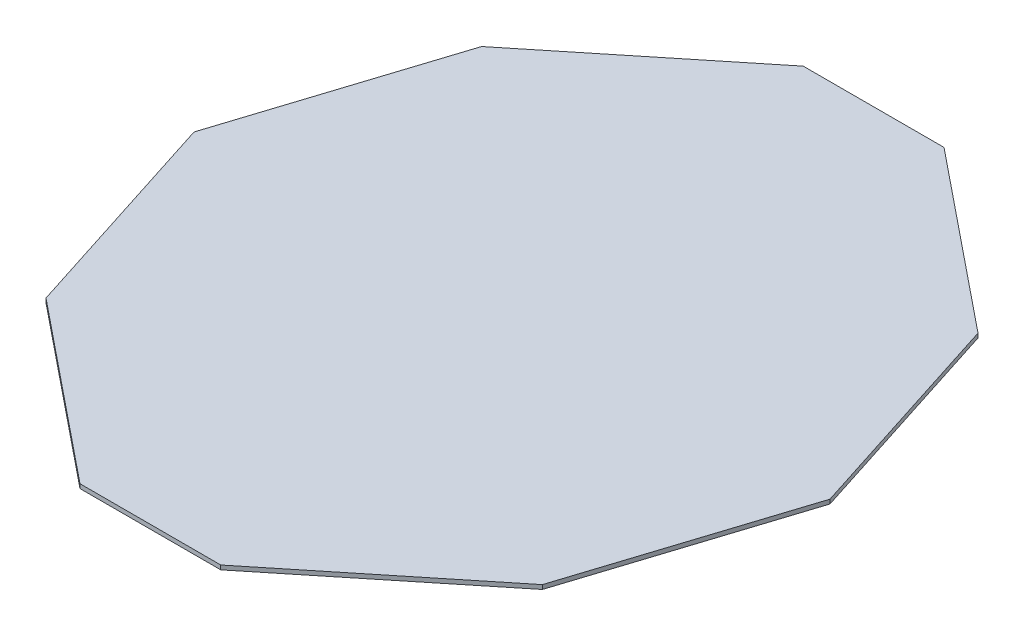
ISO-10303-21;
HEADER;
FILE_DESCRIPTION(('STEP AP214'),'2;1');
FILE_NAME('part.step','',(''),(''),'','','');
FILE_SCHEMA(('AUTOMOTIVE_DESIGN { 1 0 10303 214 1 1 1 1 }'));
ENDSEC;
DATA;
#1=APPLICATION_CONTEXT('core data for automotive mechanical design processes');
#2=APPLICATION_PROTOCOL_DEFINITION('international standard','automotive_design',2000,#1);
#3=PRODUCT_CONTEXT('',#1,'mechanical');
#4=PRODUCT('Part','Part','',(#3));
#5=PRODUCT_RELATED_PRODUCT_CATEGORY('part','',(#4));
#6=PRODUCT_DEFINITION_FORMATION('','',#4);
#7=PRODUCT_DEFINITION_CONTEXT('part definition',#1,'design');
#8=PRODUCT_DEFINITION('design','',#6,#7);
#9=PRODUCT_DEFINITION_SHAPE('','',#8);
#10=(LENGTH_UNIT() NAMED_UNIT(*) SI_UNIT(.MILLI.,.METRE.));
#11=(NAMED_UNIT(*) PLANE_ANGLE_UNIT() SI_UNIT($,.RADIAN.));
#12=(NAMED_UNIT(*) SI_UNIT($,.STERADIAN.) SOLID_ANGLE_UNIT());
#13=UNCERTAINTY_MEASURE_WITH_UNIT(LENGTH_MEASURE(1.E-05),#10,'distance_accuracy_value','');
#14=(GEOMETRIC_REPRESENTATION_CONTEXT(3) GLOBAL_UNCERTAINTY_ASSIGNED_CONTEXT((#13)) GLOBAL_UNIT_ASSIGNED_CONTEXT((#10,
#11,#12)) REPRESENTATION_CONTEXT('',''));
#15=CARTESIAN_POINT('',(0.,0.,0.));
#16=DIRECTION('',(0.,0.,1.));
#17=DIRECTION('',(1.,0.,0.));
#18=AXIS2_PLACEMENT_3D('',#15,#16,#17);
#19=CARTESIAN_POINT('',(-10.1075721399106,0.24,-8.1753890082676));
#20=DIRECTION('',(0.628876077559046,0.,-0.777505549223894));
#21=DIRECTION('',(-0.777505549223894,0.,-0.628876077559046));
#22=AXIS2_PLACEMENT_3D('',#19,#20,#21);
#23=PLANE('',#22);
#24=DIRECTION('',(0.777505549223894,0.,0.628876077559046));
#25=VECTOR('',#24,1.);
#26=CARTESIAN_POINT('',(-10.1075721399106,0.,-8.1753890082676));
#27=LINE('',#26,#25);
#28=CARTESIAN_POINT('',(-10.1075721399106,0.,-8.1753890082676));
#29=VERTEX_POINT('',#28);
#30=CARTESIAN_POINT('',(0.,0.,0.));
#31=VERTEX_POINT('',#30);
#32=EDGE_CURVE('E161',#29,#31,#27,.T.);
#33=ORIENTED_EDGE('',*,*,#32,.T.);
#34=DIRECTION('',(0.,-1.,0.));
#35=VECTOR('',#34,1.);
#36=CARTESIAN_POINT('',(0.,0.24,0.));
#37=LINE('',#36,#35);
#38=CARTESIAN_POINT('',(0.,0.24,0.));
#39=VERTEX_POINT('',#38);
#40=EDGE_CURVE('E11',#39,#31,#37,.T.);
#41=ORIENTED_EDGE('',*,*,#40,.F.);
#42=DIRECTION('',(0.777505549223894,0.,0.628876077559046));
#43=VECTOR('',#42,1.);
#44=CARTESIAN_POINT('',(-10.1075721399106,0.24,-8.1753890082676));
#45=LINE('',#44,#43);
#46=CARTESIAN_POINT('',(-10.1075721399106,0.24,-8.1753890082676));
#47=VERTEX_POINT('',#46);
#48=EDGE_CURVE('E184',#47,#39,#45,.T.);
#49=ORIENTED_EDGE('',*,*,#48,.F.);
#50=DIRECTION('',(0.,-1.,0.));
#51=VECTOR('',#50,1.);
#52=CARTESIAN_POINT('',(-10.1075721399106,0.24,-8.1753890082676));
#53=LINE('',#52,#51);
#54=EDGE_CURVE('E157',#47,#29,#53,.T.);
#55=ORIENTED_EDGE('',*,*,#54,.T.);
#56=EDGE_LOOP('',(#33,#41,#49,#55));
#57=FACE_BOUND('',#56,.T.);
#58=ADVANCED_FACE('F40',(#57),#23,.F.);
#59=CARTESIAN_POINT('',(0.,0.24,0.));
#60=DIRECTION('',(0.,0.,-1.));
#61=DIRECTION('',(-1.,0.,0.));
#62=AXIS2_PLACEMENT_3D('',#59,#60,#61);
#63=PLANE('',#62);
#64=DIRECTION('',(1.,0.,0.));
#65=VECTOR('',#64,1.);
#66=CARTESIAN_POINT('',(0.,0.,0.));
#67=LINE('',#66,#65);
#68=CARTESIAN_POINT('',(8.,0.,0.));
#69=VERTEX_POINT('',#68);
#70=EDGE_CURVE('E164',#31,#69,#67,.T.);
#71=ORIENTED_EDGE('',*,*,#70,.T.);
#72=DIRECTION('',(0.,-1.,0.));
#73=VECTOR('',#72,1.);
#74=CARTESIAN_POINT('',(8.,0.24,0.));
#75=LINE('',#74,#73);
#76=CARTESIAN_POINT('',(8.,0.24,0.));
#77=VERTEX_POINT('',#76);
#78=EDGE_CURVE('E48',#77,#69,#75,.T.);
#79=ORIENTED_EDGE('',*,*,#78,.F.);
#80=DIRECTION('',(1.,0.,0.));
#81=VECTOR('',#80,1.);
#82=CARTESIAN_POINT('',(0.,0.24,0.));
#83=LINE('',#82,#81);
#84=EDGE_CURVE('E111',#39,#77,#83,.T.);
#85=ORIENTED_EDGE('',*,*,#84,.F.);
#86=ORIENTED_EDGE('',*,*,#40,.T.);
#87=EDGE_LOOP('',(#71,#79,#85,#86));
#88=FACE_BOUND('',#87,.T.);
#89=ADVANCED_FACE('F239',(#88),#63,.F.);
#90=CARTESIAN_POINT('',(8.,0.24,0.));
#91=DIRECTION('',(-0.628876077559046,0.,-0.777505549223894));
#92=DIRECTION('',(-0.777505549223894,0.,0.628876077559046));
#93=AXIS2_PLACEMENT_3D('',#90,#91,#92);
#94=PLANE('',#93);
#95=DIRECTION('',(0.777505549223894,0.,-0.628876077559046));
#96=VECTOR('',#95,1.);
#97=CARTESIAN_POINT('',(8.,0.,0.));
#98=LINE('',#97,#96);
#99=CARTESIAN_POINT('',(18.1075721399106,0.,-8.1753890082676));
#100=VERTEX_POINT('',#99);
#101=EDGE_CURVE('E166',#69,#100,#98,.T.);
#102=ORIENTED_EDGE('',*,*,#101,.T.);
#103=DIRECTION('',(0.,-1.,0.));
#104=VECTOR('',#103,1.);
#105=CARTESIAN_POINT('',(18.1075721399106,0.24,-8.1753890082676));
#106=LINE('',#105,#104);
#107=CARTESIAN_POINT('',(18.1075721399106,0.24,-8.1753890082676));
#108=VERTEX_POINT('',#107);
#109=EDGE_CURVE('E199',#108,#100,#106,.T.);
#110=ORIENTED_EDGE('',*,*,#109,.F.);
#111=DIRECTION('',(0.777505549223894,0.,-0.628876077559046));
#112=VECTOR('',#111,1.);
#113=CARTESIAN_POINT('',(8.,0.24,0.));
#114=LINE('',#113,#112);
#115=EDGE_CURVE('E208',#77,#108,#114,.T.);
#116=ORIENTED_EDGE('',*,*,#115,.F.);
#117=ORIENTED_EDGE('',*,*,#78,.T.);
#118=EDGE_LOOP('',(#102,#110,#116,#117));
#119=FACE_BOUND('',#118,.T.);
#120=ADVANCED_FACE('F206',(#119),#94,.F.);
#121=CARTESIAN_POINT('',(18.1075721399106,0.24,-8.1753890082676));
#122=DIRECTION('',(-0.952322350293671,0.,-0.305093659604947));
#123=DIRECTION('',(-0.305093659604947,0.,0.952322350293671));
#124=AXIS2_PLACEMENT_3D('',#121,#122,#123);
#125=PLANE('',#124);
#126=DIRECTION('',(0.305093659604947,0.,-0.952322350293671));
#127=VECTOR('',#126,1.);
#128=CARTESIAN_POINT('',(18.1075721399106,0.,-8.1753890082676));
#129=LINE('',#128,#127);
#130=CARTESIAN_POINT('',(22.0737897147749,0.,-20.5555795620853));
#131=VERTEX_POINT('',#130);
#132=EDGE_CURVE('E169',#100,#131,#129,.T.);
#133=ORIENTED_EDGE('',*,*,#132,.T.);
#134=DIRECTION('',(0.,-1.,0.));
#135=VECTOR('',#134,1.);
#136=CARTESIAN_POINT('',(22.0737897147749,0.24,-20.5555795620853));
#137=LINE('',#136,#135);
#138=CARTESIAN_POINT('',(22.0737897147749,0.24,-20.5555795620853));
#139=VERTEX_POINT('',#138);
#140=EDGE_CURVE('E196',#139,#131,#137,.T.);
#141=ORIENTED_EDGE('',*,*,#140,.F.);
#142=DIRECTION('',(0.305093659604947,0.,-0.952322350293671));
#143=VECTOR('',#142,1.);
#144=CARTESIAN_POINT('',(18.1075721399106,0.24,-8.1753890082676));
#145=LINE('',#144,#143);
#146=EDGE_CURVE('E226',#108,#139,#145,.T.);
#147=ORIENTED_EDGE('',*,*,#146,.F.);
#148=ORIENTED_EDGE('',*,*,#109,.T.);
#149=EDGE_LOOP('',(#133,#141,#147,#148));
#150=FACE_BOUND('',#149,.T.);
#151=ADVANCED_FACE('F217',(#150),#125,.F.);
#152=CARTESIAN_POINT('',(22.0737897147749,0.24,-20.5555795620853));
#153=DIRECTION('',(-0.952322350293671,0.,0.305093659604947));
#154=DIRECTION('',(0.305093659604947,0.,0.952322350293671));
#155=AXIS2_PLACEMENT_3D('',#152,#153,#154);
#156=PLANE('',#155);
#157=DIRECTION('',(-0.305093659604947,0.,-0.952322350293671));
#158=VECTOR('',#157,1.);
#159=CARTESIAN_POINT('',(22.0737897147749,0.,-20.5555795620853));
#160=LINE('',#159,#158);
#161=CARTESIAN_POINT('',(18.1075721399106,0.,-32.935770115903));
#162=VERTEX_POINT('',#161);
#163=EDGE_CURVE('E172',#131,#162,#160,.T.);
#164=ORIENTED_EDGE('',*,*,#163,.T.);
#165=DIRECTION('',(0.,-1.,0.));
#166=VECTOR('',#165,1.);
#167=CARTESIAN_POINT('',(18.1075721399106,0.24,-32.935770115903));
#168=LINE('',#167,#166);
#169=CARTESIAN_POINT('',(18.1075721399106,0.24,-32.935770115903));
#170=VERTEX_POINT('',#169);
#171=EDGE_CURVE('E193',#170,#162,#168,.T.);
#172=ORIENTED_EDGE('',*,*,#171,.F.);
#173=DIRECTION('',(-0.305093659604947,0.,-0.952322350293671));
#174=VECTOR('',#173,1.);
#175=CARTESIAN_POINT('',(22.0737897147749,0.24,-20.5555795620853));
#176=LINE('',#175,#174);
#177=EDGE_CURVE('E223',#139,#170,#176,.T.);
#178=ORIENTED_EDGE('',*,*,#177,.F.);
#179=ORIENTED_EDGE('',*,*,#140,.T.);
#180=EDGE_LOOP('',(#164,#172,#178,#179));
#181=FACE_BOUND('',#180,.T.);
#182=ADVANCED_FACE('F221',(#181),#156,.F.);
#183=CARTESIAN_POINT('',(18.1075721399106,0.24,-32.935770115903));
#184=DIRECTION('',(-0.628876077559046,0.,0.777505549223894));
#185=DIRECTION('',(0.777505549223894,0.,0.628876077559046));
#186=AXIS2_PLACEMENT_3D('',#183,#184,#185);
#187=PLANE('',#186);
#188=DIRECTION('',(-0.777505549223894,0.,-0.628876077559046));
#189=VECTOR('',#188,1.);
#190=CARTESIAN_POINT('',(18.1075721399106,0.,-32.935770115903));
#191=LINE('',#190,#189);
#192=CARTESIAN_POINT('',(7.99999999999999,0.,-41.1111591241706));
#193=VERTEX_POINT('',#192);
#194=EDGE_CURVE('E174',#162,#193,#191,.T.);
#195=ORIENTED_EDGE('',*,*,#194,.T.);
#196=DIRECTION('',(0.,-1.,0.));
#197=VECTOR('',#196,1.);
#198=CARTESIAN_POINT('',(7.99999999999999,0.24,-41.1111591241706));
#199=LINE('',#198,#197);
#200=CARTESIAN_POINT('',(7.99999999999999,0.24,-41.1111591241706));
#201=VERTEX_POINT('',#200);
#202=EDGE_CURVE('E190',#201,#193,#199,.T.);
#203=ORIENTED_EDGE('',*,*,#202,.F.);
#204=DIRECTION('',(-0.777505549223894,0.,-0.628876077559046));
#205=VECTOR('',#204,1.);
#206=CARTESIAN_POINT('',(18.1075721399106,0.24,-32.935770115903));
#207=LINE('',#206,#205);
#208=EDGE_CURVE('E225',#170,#201,#207,.T.);
#209=ORIENTED_EDGE('',*,*,#208,.F.);
#210=ORIENTED_EDGE('',*,*,#171,.T.);
#211=EDGE_LOOP('',(#195,#203,#209,#210));
#212=FACE_BOUND('',#211,.T.);
#213=ADVANCED_FACE('F251',(#212),#187,.F.);
#214=CARTESIAN_POINT('',(7.99999999999999,0.24,-41.1111591241706));
#215=DIRECTION('',(0.,0.,1.));
#216=DIRECTION('',(1.,0.,0.));
#217=AXIS2_PLACEMENT_3D('',#214,#215,#216);
#218=PLANE('',#217);
#219=DIRECTION('',(-1.,0.,0.));
#220=VECTOR('',#219,1.);
#221=CARTESIAN_POINT('',(7.99999999999999,0.,-41.1111591241706));
#222=LINE('',#221,#220);
#223=CARTESIAN_POINT('',(0.,0.,-41.1111591241706));
#224=VERTEX_POINT('',#223);
#225=EDGE_CURVE('E176',#193,#224,#222,.T.);
#226=ORIENTED_EDGE('',*,*,#225,.T.);
#227=DIRECTION('',(0.,-1.,0.));
#228=VECTOR('',#227,1.);
#229=CARTESIAN_POINT('',(0.,0.24,-41.1111591241706));
#230=LINE('',#229,#228);
#231=CARTESIAN_POINT('',(0.,0.24,-41.1111591241706));
#232=VERTEX_POINT('',#231);
#233=EDGE_CURVE('E149',#232,#224,#230,.T.);
#234=ORIENTED_EDGE('',*,*,#233,.F.);
#235=DIRECTION('',(-1.,0.,0.));
#236=VECTOR('',#235,1.);
#237=CARTESIAN_POINT('',(7.99999999999999,0.24,-41.1111591241706));
#238=LINE('',#237,#236);
#239=EDGE_CURVE('E138',#201,#232,#238,.T.);
#240=ORIENTED_EDGE('',*,*,#239,.F.);
#241=ORIENTED_EDGE('',*,*,#202,.T.);
#242=EDGE_LOOP('',(#226,#234,#240,#241));
#243=FACE_BOUND('',#242,.T.);
#244=ADVANCED_FACE('F254',(#243),#218,.F.);
#245=CARTESIAN_POINT('',(0.,0.24,-41.1111591241706));
#246=DIRECTION('',(0.628876077559047,0.,0.777505549223893));
#247=DIRECTION('',(0.777505549223893,0.,-0.628876077559047));
#248=AXIS2_PLACEMENT_3D('',#245,#246,#247);
#249=PLANE('',#248);
#250=DIRECTION('',(-0.777505549223893,0.,0.628876077559047));
#251=VECTOR('',#250,1.);
#252=CARTESIAN_POINT('',(0.,0.,-41.1111591241706));
#253=LINE('',#252,#251);
#254=CARTESIAN_POINT('',(-10.1075721399106,0.,-32.935770115903));
#255=VERTEX_POINT('',#254);
#256=EDGE_CURVE('E147',#224,#255,#253,.T.);
#257=ORIENTED_EDGE('',*,*,#256,.T.);
#258=DIRECTION('',(0.,-1.,0.));
#259=VECTOR('',#258,1.);
#260=CARTESIAN_POINT('',(-10.1075721399106,0.24,-32.935770115903));
#261=LINE('',#260,#259);
#262=CARTESIAN_POINT('',(-10.1075721399106,0.24,-32.935770115903));
#263=VERTEX_POINT('',#262);
#264=EDGE_CURVE('E144',#263,#255,#261,.T.);
#265=ORIENTED_EDGE('',*,*,#264,.F.);
#266=DIRECTION('',(-0.777505549223893,0.,0.628876077559047));
#267=VECTOR('',#266,1.);
#268=CARTESIAN_POINT('',(0.,0.24,-41.1111591241706));
#269=LINE('',#268,#267);
#270=EDGE_CURVE('E132',#232,#263,#269,.T.);
#271=ORIENTED_EDGE('',*,*,#270,.F.);
#272=ORIENTED_EDGE('',*,*,#233,.T.);
#273=EDGE_LOOP('',(#257,#265,#271,#272));
#274=FACE_BOUND('',#273,.T.);
#275=ADVANCED_FACE('F145',(#274),#249,.F.);
#276=CARTESIAN_POINT('',(-10.1075721399106,0.24,-32.935770115903));
#277=DIRECTION('',(0.952322350293671,0.,0.305093659604947));
#278=DIRECTION('',(0.305093659604947,0.,-0.952322350293671));
#279=AXIS2_PLACEMENT_3D('',#276,#277,#278);
#280=PLANE('',#279);
#281=DIRECTION('',(-0.305093659604947,0.,0.952322350293671));
#282=VECTOR('',#281,1.);
#283=CARTESIAN_POINT('',(-10.1075721399106,0.,-32.935770115903));
#284=LINE('',#283,#282);
#285=CARTESIAN_POINT('',(-14.0737897147749,0.,-20.5555795620853));
#286=VERTEX_POINT('',#285);
#287=EDGE_CURVE('E97',#255,#286,#284,.T.);
#288=ORIENTED_EDGE('',*,*,#287,.T.);
#289=DIRECTION('',(0.,-1.,0.));
#290=VECTOR('',#289,1.);
#291=CARTESIAN_POINT('',(-14.0737897147749,0.24,-20.5555795620853));
#292=LINE('',#291,#290);
#293=CARTESIAN_POINT('',(-14.0737897147749,0.24,-20.5555795620853));
#294=VERTEX_POINT('',#293);
#295=EDGE_CURVE('E150',#294,#286,#292,.T.);
#296=ORIENTED_EDGE('',*,*,#295,.F.);
#297=DIRECTION('',(-0.305093659604947,0.,0.952322350293671));
#298=VECTOR('',#297,1.);
#299=CARTESIAN_POINT('',(-10.1075721399106,0.24,-32.935770115903));
#300=LINE('',#299,#298);
#301=EDGE_CURVE('E136',#263,#294,#300,.T.);
#302=ORIENTED_EDGE('',*,*,#301,.F.);
#303=ORIENTED_EDGE('',*,*,#264,.T.);
#304=EDGE_LOOP('',(#288,#296,#302,#303));
#305=FACE_BOUND('',#304,.T.);
#306=ADVANCED_FACE('F152',(#305),#280,.F.);
#307=CARTESIAN_POINT('',(-14.0737897147749,0.24,-20.5555795620853));
#308=DIRECTION('',(0.952322350293671,0.,-0.305093659604947));
#309=DIRECTION('',(-0.305093659604947,0.,-0.952322350293671));
#310=AXIS2_PLACEMENT_3D('',#307,#308,#309);
#311=PLANE('',#310);
#312=DIRECTION('',(0.305093659604947,0.,0.952322350293671));
#313=VECTOR('',#312,1.);
#314=CARTESIAN_POINT('',(-14.0737897147749,0.,-20.5555795620853));
#315=LINE('',#314,#313);
#316=EDGE_CURVE('E103',#286,#29,#315,.T.);
#317=ORIENTED_EDGE('',*,*,#316,.T.);
#318=ORIENTED_EDGE('',*,*,#54,.F.);
#319=DIRECTION('',(0.305093659604947,0.,0.952322350293671));
#320=VECTOR('',#319,1.);
#321=CARTESIAN_POINT('',(-14.0737897147749,0.24,-20.5555795620853));
#322=LINE('',#321,#320);
#323=EDGE_CURVE('E56',#294,#47,#322,.T.);
#324=ORIENTED_EDGE('',*,*,#323,.F.);
#325=ORIENTED_EDGE('',*,*,#295,.T.);
#326=EDGE_LOOP('',(#317,#318,#324,#325));
#327=FACE_BOUND('',#326,.T.);
#328=ADVANCED_FACE('F263',(#327),#311,.F.);
#329=CARTESIAN_POINT('',(0.,0.24,0.));
#330=DIRECTION('',(0.,1.,0.));
#331=DIRECTION('',(0.,0.,1.));
#332=AXIS2_PLACEMENT_3D('',#329,#330,#331);
#333=PLANE('',#332);
#334=ORIENTED_EDGE('',*,*,#48,.T.);
#335=ORIENTED_EDGE('',*,*,#84,.T.);
#336=ORIENTED_EDGE('',*,*,#115,.T.);
#337=ORIENTED_EDGE('',*,*,#146,.T.);
#338=ORIENTED_EDGE('',*,*,#177,.T.);
#339=ORIENTED_EDGE('',*,*,#208,.T.);
#340=ORIENTED_EDGE('',*,*,#239,.T.);
#341=ORIENTED_EDGE('',*,*,#270,.T.);
#342=ORIENTED_EDGE('',*,*,#301,.T.);
#343=ORIENTED_EDGE('',*,*,#323,.T.);
#344=EDGE_LOOP('',(#334,#335,#336,#337,#338,#339,#340,#341,#342,#343));
#345=FACE_BOUND('',#344,.T.);
#346=ADVANCED_FACE('F134',(#345),#333,.T.);
#347=CARTESIAN_POINT('',(0.,0.,0.));
#348=DIRECTION('',(0.,1.,0.));
#349=DIRECTION('',(0.,0.,1.));
#350=AXIS2_PLACEMENT_3D('',#347,#348,#349);
#351=PLANE('',#350);
#352=ORIENTED_EDGE('',*,*,#32,.F.);
#353=ORIENTED_EDGE('',*,*,#316,.F.);
#354=ORIENTED_EDGE('',*,*,#287,.F.);
#355=ORIENTED_EDGE('',*,*,#256,.F.);
#356=ORIENTED_EDGE('',*,*,#225,.F.);
#357=ORIENTED_EDGE('',*,*,#194,.F.);
#358=ORIENTED_EDGE('',*,*,#163,.F.);
#359=ORIENTED_EDGE('',*,*,#132,.F.);
#360=ORIENTED_EDGE('',*,*,#101,.F.);
#361=ORIENTED_EDGE('',*,*,#70,.F.);
#362=EDGE_LOOP('',(#352,#353,#354,#355,#356,#357,#358,#359,#360,#361));
#363=FACE_BOUND('',#362,.T.);
#364=ADVANCED_FACE('F212',(#363),#351,.F.);
#365=CLOSED_SHELL('',(#58,#89,#120,#151,#182,#213,#244,#275,#306,#328,#346,#364));
#366=MANIFOLD_SOLID_BREP('B2',#365);
#367=ADVANCED_BREP_SHAPE_REPRESENTATION('',(#18,#366),#14);
#368=SHAPE_DEFINITION_REPRESENTATION(#9,#367);
ENDSEC;
END-ISO-10303-21;
